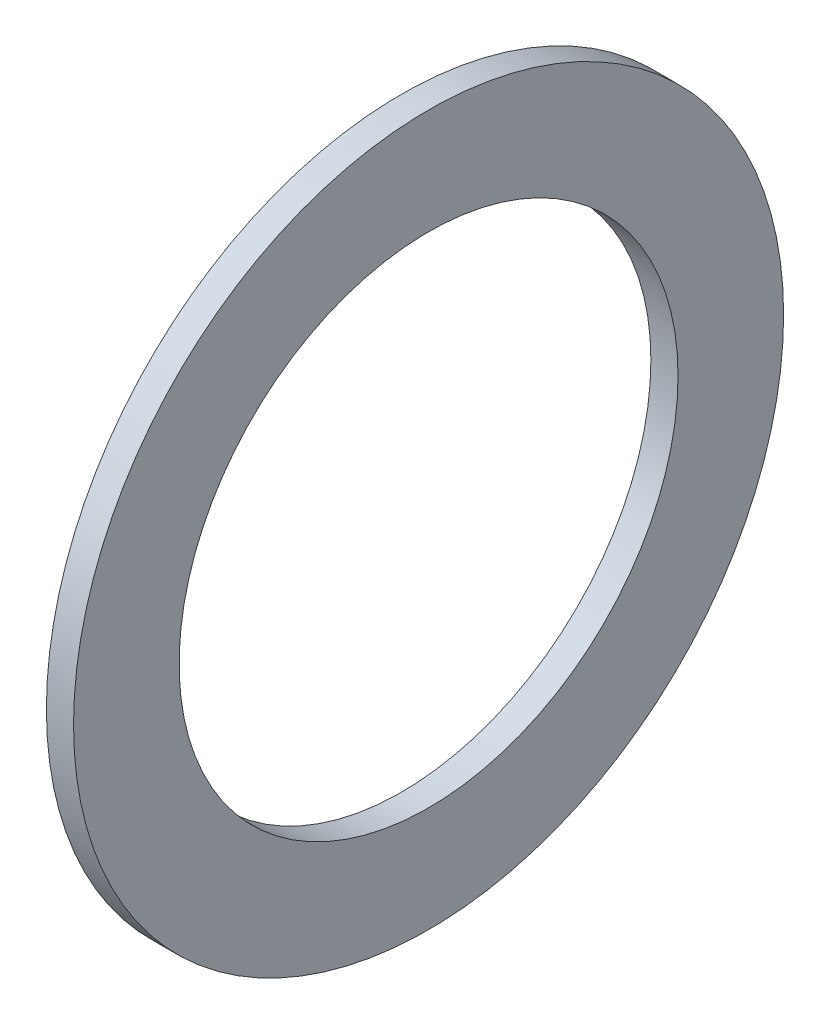
ISO-10303-21;
HEADER;
FILE_DESCRIPTION(('STEP AP214'),'2;1');
FILE_NAME('part.step','',(''),(''),'','','');
FILE_SCHEMA(('AUTOMOTIVE_DESIGN { 1 0 10303 214 1 1 1 1 }'));
ENDSEC;
DATA;
#1=APPLICATION_CONTEXT('core data for automotive mechanical design processes');
#2=APPLICATION_PROTOCOL_DEFINITION('international standard','automotive_design',2000,#1);
#3=PRODUCT_CONTEXT('',#1,'mechanical');
#4=PRODUCT('Part','Part','',(#3));
#5=PRODUCT_RELATED_PRODUCT_CATEGORY('part','',(#4));
#6=PRODUCT_DEFINITION_FORMATION('','',#4);
#7=PRODUCT_DEFINITION_CONTEXT('part definition',#1,'design');
#8=PRODUCT_DEFINITION('design','',#6,#7);
#9=PRODUCT_DEFINITION_SHAPE('','',#8);
#10=(LENGTH_UNIT() NAMED_UNIT(*) SI_UNIT(.MILLI.,.METRE.));
#11=(NAMED_UNIT(*) PLANE_ANGLE_UNIT() SI_UNIT($,.RADIAN.));
#12=(NAMED_UNIT(*) SI_UNIT($,.STERADIAN.) SOLID_ANGLE_UNIT());
#13=UNCERTAINTY_MEASURE_WITH_UNIT(LENGTH_MEASURE(1.E-05),#10,'distance_accuracy_value','');
#14=(GEOMETRIC_REPRESENTATION_CONTEXT(3) GLOBAL_UNCERTAINTY_ASSIGNED_CONTEXT((#13)) GLOBAL_UNIT_ASSIGNED_CONTEXT((#10,
#11,#12)) REPRESENTATION_CONTEXT('',''));
#15=CARTESIAN_POINT('',(0.,0.,0.));
#16=DIRECTION('',(0.,0.,1.));
#17=DIRECTION('',(1.,0.,0.));
#18=AXIS2_PLACEMENT_3D('',#15,#16,#17);
#19=CARTESIAN_POINT('',(0.65,0.,0.));
#20=DIRECTION('',(1.,0.,0.));
#21=DIRECTION('',(0.,0.,-1.));
#22=AXIS2_PLACEMENT_3D('',#19,#20,#21);
#23=PLANE('',#22);
#24=CARTESIAN_POINT('',(0.65,0.,0.));
#25=DIRECTION('',(1.,0.,0.));
#26=DIRECTION('',(0.,0.,-1.));
#27=AXIS2_PLACEMENT_3D('',#24,#25,#26);
#28=CIRCLE('',#27,17.);
#29=CARTESIAN_POINT('',(0.65,0.,-17.));
#30=VERTEX_POINT('',#29);
#31=EDGE_CURVE('E10',#30,#30,#28,.T.);
#32=ORIENTED_EDGE('',*,*,#31,.T.);
#33=EDGE_LOOP('',(#32));
#34=FACE_BOUND('',#33,.T.);
#35=CARTESIAN_POINT('',(0.65,0.,0.));
#36=DIRECTION('',(1.,0.,0.));
#37=DIRECTION('',(0.,0.,-1.));
#38=AXIS2_PLACEMENT_3D('',#35,#36,#37);
#39=CIRCLE('',#38,11.945);
#40=CARTESIAN_POINT('',(0.65,0.,-11.945));
#41=VERTEX_POINT('',#40);
#42=EDGE_CURVE('E48',#41,#41,#39,.T.);
#43=ORIENTED_EDGE('',*,*,#42,.F.);
#44=EDGE_LOOP('',(#43));
#45=FACE_BOUND('',#44,.T.);
#46=ADVANCED_FACE('F37',(#34,#45),#23,.T.);
#47=CARTESIAN_POINT('',(-0.65,0.,0.));
#48=DIRECTION('',(1.,0.,0.));
#49=DIRECTION('',(0.,0.,-1.));
#50=AXIS2_PLACEMENT_3D('',#47,#48,#49);
#51=PLANE('',#50);
#52=CARTESIAN_POINT('',(-0.65,0.,0.));
#53=DIRECTION('',(1.,0.,0.));
#54=DIRECTION('',(0.,0.,-1.));
#55=AXIS2_PLACEMENT_3D('',#52,#53,#54);
#56=CIRCLE('',#55,17.);
#57=CARTESIAN_POINT('',(-0.65,0.,-17.));
#58=VERTEX_POINT('',#57);
#59=EDGE_CURVE('E41',#58,#58,#56,.T.);
#60=ORIENTED_EDGE('',*,*,#59,.F.);
#61=EDGE_LOOP('',(#60));
#62=FACE_BOUND('',#61,.T.);
#63=CARTESIAN_POINT('',(-0.65,0.,0.));
#64=DIRECTION('',(1.,0.,0.));
#65=DIRECTION('',(0.,0.,-1.));
#66=AXIS2_PLACEMENT_3D('',#63,#64,#65);
#67=CIRCLE('',#66,11.945);
#68=CARTESIAN_POINT('',(-0.65,0.,-11.945));
#69=VERTEX_POINT('',#68);
#70=EDGE_CURVE('E50',#69,#69,#67,.T.);
#71=ORIENTED_EDGE('',*,*,#70,.T.);
#72=EDGE_LOOP('',(#71));
#73=FACE_BOUND('',#72,.T.);
#74=ADVANCED_FACE('F60',(#62,#73),#51,.F.);
#75=CARTESIAN_POINT('',(0.65,0.,0.));
#76=DIRECTION('',(-1.,0.,0.));
#77=DIRECTION('',(0.,0.,1.));
#78=AXIS2_PLACEMENT_3D('',#75,#76,#77);
#79=CYLINDRICAL_SURFACE('',#78,17.);
#80=ORIENTED_EDGE('',*,*,#31,.F.);
#81=EDGE_LOOP('',(#80));
#82=FACE_BOUND('',#81,.T.);
#83=ORIENTED_EDGE('',*,*,#59,.T.);
#84=EDGE_LOOP('',(#83));
#85=FACE_BOUND('',#84,.T.);
#86=ADVANCED_FACE('F39',(#82,#85),#79,.T.);
#87=CARTESIAN_POINT('',(0.65,0.,0.));
#88=DIRECTION('',(-1.,0.,0.));
#89=DIRECTION('',(0.,0.,1.));
#90=AXIS2_PLACEMENT_3D('',#87,#88,#89);
#91=CYLINDRICAL_SURFACE('',#90,11.945);
#92=ORIENTED_EDGE('',*,*,#42,.T.);
#93=EDGE_LOOP('',(#92));
#94=FACE_BOUND('',#93,.T.);
#95=ORIENTED_EDGE('',*,*,#70,.F.);
#96=EDGE_LOOP('',(#95));
#97=FACE_BOUND('',#96,.T.);
#98=ADVANCED_FACE('F56',(#94,#97),#91,.F.);
#99=CLOSED_SHELL('',(#46,#74,#86,#98));
#100=MANIFOLD_SOLID_BREP('B2',#99);
#101=ADVANCED_BREP_SHAPE_REPRESENTATION('',(#18,#100),#14);
#102=SHAPE_DEFINITION_REPRESENTATION(#9,#101);
ENDSEC;
END-ISO-10303-21;
